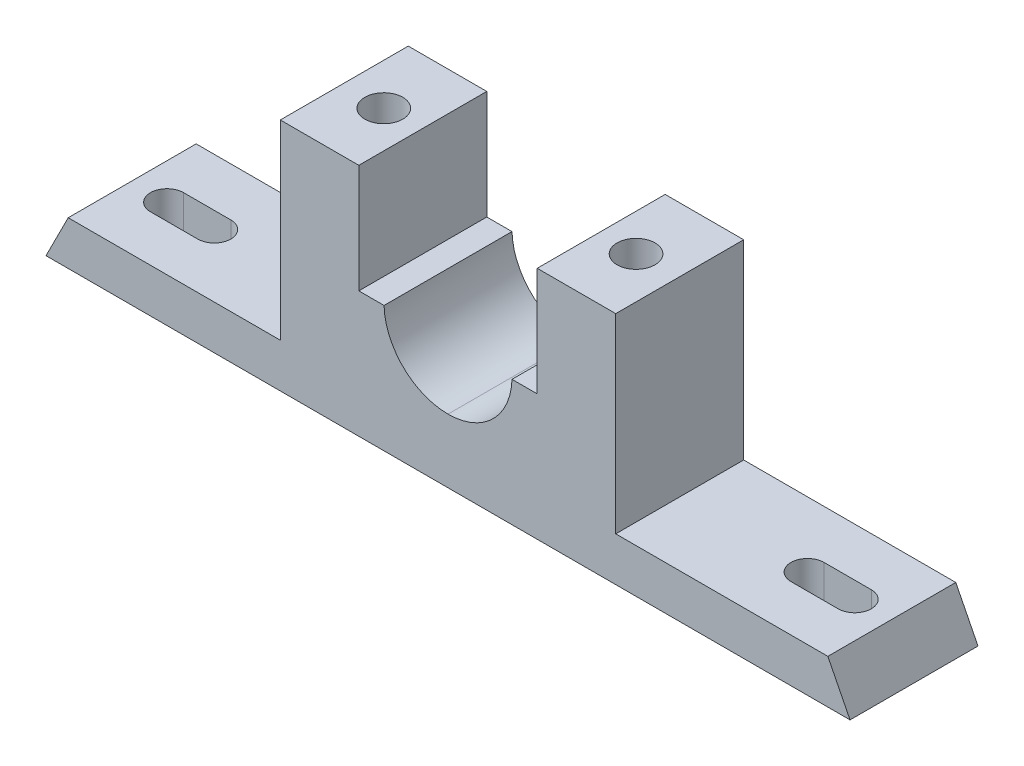
ISO-10303-21;
HEADER;
FILE_DESCRIPTION(('STEP AP214'),'2;1');
FILE_NAME('part.step','',(''),(''),'','','');
FILE_SCHEMA(('AUTOMOTIVE_DESIGN { 1 0 10303 214 1 1 1 1 }'));
ENDSEC;
DATA;
#1=APPLICATION_CONTEXT('core data for automotive mechanical design processes');
#2=APPLICATION_PROTOCOL_DEFINITION('international standard','automotive_design',2000,#1);
#3=PRODUCT_CONTEXT('',#1,'mechanical');
#4=PRODUCT('Part','Part','',(#3));
#5=PRODUCT_RELATED_PRODUCT_CATEGORY('part','',(#4));
#6=PRODUCT_DEFINITION_FORMATION('','',#4);
#7=PRODUCT_DEFINITION_CONTEXT('part definition',#1,'design');
#8=PRODUCT_DEFINITION('design','',#6,#7);
#9=PRODUCT_DEFINITION_SHAPE('','',#8);
#10=(LENGTH_UNIT() NAMED_UNIT(*) SI_UNIT(.MILLI.,.METRE.));
#11=(NAMED_UNIT(*) PLANE_ANGLE_UNIT() SI_UNIT($,.RADIAN.));
#12=(NAMED_UNIT(*) SI_UNIT($,.STERADIAN.) SOLID_ANGLE_UNIT());
#13=UNCERTAINTY_MEASURE_WITH_UNIT(LENGTH_MEASURE(1.E-05),#10,'distance_accuracy_value','');
#14=(GEOMETRIC_REPRESENTATION_CONTEXT(3) GLOBAL_UNCERTAINTY_ASSIGNED_CONTEXT((#13)) GLOBAL_UNIT_ASSIGNED_CONTEXT((#10,
#11,#12)) REPRESENTATION_CONTEXT('',''));
#15=CARTESIAN_POINT('',(0.,0.,0.));
#16=DIRECTION('',(0.,0.,1.));
#17=DIRECTION('',(1.,0.,0.));
#18=AXIS2_PLACEMENT_3D('',#15,#16,#17);
#19=CARTESIAN_POINT('',(201.084112149531,0.,64.));
#20=DIRECTION('',(0.,1.,0.));
#21=DIRECTION('',(0.,0.,1.));
#22=AXIS2_PLACEMENT_3D('',#19,#20,#21);
#23=PLANE('',#22);
#24=CARTESIAN_POINT('',(63.0841121495307,0.,33.0360593834774));
#25=DIRECTION('',(0.,-1.,0.));
#26=DIRECTION('',(0.,0.,-1.));
#27=AXIS2_PLACEMENT_3D('',#24,#25,#26);
#28=CIRCLE('',#27,15.);
#29=CARTESIAN_POINT('',(63.0841121495307,0.,18.0360593834774));
#30=VERTEX_POINT('',#29);
#31=EDGE_CURVE('E479',#30,#30,#28,.T.);
#32=ORIENTED_EDGE('',*,*,#31,.F.);
#33=EDGE_LOOP('',(#32));
#34=FACE_BOUND('',#33,.T.);
#35=DIRECTION('',(1.,0.,0.));
#36=VECTOR('',#35,1.);
#37=CARTESIAN_POINT('',(201.084112149531,0.,0.));
#38=LINE('',#37,#36);
#39=CARTESIAN_POINT('',(-201.084112149531,0.,0.));
#40=VERTEX_POINT('',#39);
#41=CARTESIAN_POINT('',(201.084112149531,0.,0.));
#42=VERTEX_POINT('',#41);
#43=EDGE_CURVE('E298',#40,#42,#38,.T.);
#44=ORIENTED_EDGE('',*,*,#43,.T.);
#45=DIRECTION('',(0.,0.,-1.));
#46=VECTOR('',#45,1.);
#47=CARTESIAN_POINT('',(201.084112149531,0.,64.));
#48=LINE('',#47,#46);
#49=CARTESIAN_POINT('',(201.084112149531,0.,64.));
#50=VERTEX_POINT('',#49);
#51=EDGE_CURVE('E11',#50,#42,#48,.T.);
#52=ORIENTED_EDGE('',*,*,#51,.F.);
#53=DIRECTION('',(1.,0.,0.));
#54=VECTOR('',#53,1.);
#55=CARTESIAN_POINT('',(201.084112149531,0.,64.));
#56=LINE('',#55,#54);
#57=CARTESIAN_POINT('',(-201.084112149531,0.,64.));
#58=VERTEX_POINT('',#57);
#59=EDGE_CURVE('E299',#58,#50,#56,.T.);
#60=ORIENTED_EDGE('',*,*,#59,.F.);
#61=DIRECTION('',(0.,0.,-1.));
#62=VECTOR('',#61,1.);
#63=CARTESIAN_POINT('',(-201.084112149531,0.,64.));
#64=LINE('',#63,#62);
#65=EDGE_CURVE('E346',#58,#40,#64,.T.);
#66=ORIENTED_EDGE('',*,*,#65,.T.);
#67=EDGE_LOOP('',(#44,#52,#60,#66));
#68=FACE_BOUND('',#67,.T.);
#69=DIRECTION('',(-1.,0.,0.));
#70=VECTOR('',#69,1.);
#71=CARTESIAN_POINT('',(201.084112149531,0.,24.2735142922361));
#72=LINE('',#71,#70);
#73=CARTESIAN_POINT('',(-148.363703714019,0.,24.2735142922361));
#74=VERTEX_POINT('',#73);
#75=CARTESIAN_POINT('',(-171.985857657313,0.,24.2735142922361));
#76=VERTEX_POINT('',#75);
#77=EDGE_CURVE('E290',#74,#76,#72,.T.);
#78=ORIENTED_EDGE('',*,*,#77,.T.);
#79=CARTESIAN_POINT('',(-171.985857657313,0.,32.5619893600584));
#80=DIRECTION('',(0.,1.,0.));
#81=DIRECTION('',(0.,0.,1.));
#82=AXIS2_PLACEMENT_3D('',#79,#80,#81);
#83=CIRCLE('',#82,8.28847506782232);
#84=CARTESIAN_POINT('',(-171.985857657313,0.,40.8504644278807));
#85=VERTEX_POINT('',#84);
#86=EDGE_CURVE('E294',#76,#85,#83,.T.);
#87=ORIENTED_EDGE('',*,*,#86,.T.);
#88=DIRECTION('',(1.,0.,0.));
#89=VECTOR('',#88,1.);
#90=CARTESIAN_POINT('',(201.084112149531,0.,40.8504644278807));
#91=LINE('',#90,#89);
#92=CARTESIAN_POINT('',(-148.363703714019,0.,40.8504644278807));
#93=VERTEX_POINT('',#92);
#94=EDGE_CURVE('E273',#85,#93,#91,.T.);
#95=ORIENTED_EDGE('',*,*,#94,.T.);
#96=CARTESIAN_POINT('',(-148.363703714019,0.,32.5619893600584));
#97=DIRECTION('',(0.,1.,0.));
#98=DIRECTION('',(0.,0.,1.));
#99=AXIS2_PLACEMENT_3D('',#96,#97,#98);
#100=CIRCLE('',#99,8.28847506782232);
#101=EDGE_CURVE('E286',#93,#74,#100,.T.);
#102=ORIENTED_EDGE('',*,*,#101,.T.);
#103=EDGE_LOOP('',(#78,#87,#95,#102));
#104=FACE_BOUND('',#103,.T.);
#105=CARTESIAN_POINT('',(-63.0841121495307,0.,33.0360593834774));
#106=DIRECTION('',(0.,-1.,0.));
#107=DIRECTION('',(0.,0.,-1.));
#108=AXIS2_PLACEMENT_3D('',#105,#106,#107);
#109=CIRCLE('',#108,15.);
#110=CARTESIAN_POINT('',(-63.0841121495307,0.,18.0360593834774));
#111=VERTEX_POINT('',#110);
#112=EDGE_CURVE('E241',#111,#111,#109,.T.);
#113=ORIENTED_EDGE('',*,*,#112,.F.);
#114=EDGE_LOOP('',(#113));
#115=FACE_BOUND('',#114,.T.);
#116=CARTESIAN_POINT('',(171.985857657313,0.,32.5619893600584));
#117=DIRECTION('',(0.,1.,0.));
#118=DIRECTION('',(0.,0.,1.));
#119=AXIS2_PLACEMENT_3D('',#116,#117,#118);
#120=CIRCLE('',#119,8.28847506782232);
#121=CARTESIAN_POINT('',(171.985857657313,0.,24.2735142922361));
#122=VERTEX_POINT('',#121);
#123=CARTESIAN_POINT('',(171.985857657313,0.,40.8504644278807));
#124=VERTEX_POINT('',#123);
#125=EDGE_CURVE('E238',#122,#124,#120,.F.);
#126=ORIENTED_EDGE('',*,*,#125,.F.);
#127=DIRECTION('',(1.,0.,0.));
#128=VECTOR('',#127,1.);
#129=CARTESIAN_POINT('',(201.084112149531,0.,24.2735142922361));
#130=LINE('',#129,#128);
#131=CARTESIAN_POINT('',(148.363703714019,0.,24.2735142922361));
#132=VERTEX_POINT('',#131);
#133=EDGE_CURVE('E226',#132,#122,#130,.T.);
#134=ORIENTED_EDGE('',*,*,#133,.F.);
#135=CARTESIAN_POINT('',(148.363703714019,0.,32.5619893600584));
#136=DIRECTION('',(0.,1.,0.));
#137=DIRECTION('',(0.,0.,1.));
#138=AXIS2_PLACEMENT_3D('',#135,#136,#137);
#139=CIRCLE('',#138,8.28847506782232);
#140=CARTESIAN_POINT('',(148.363703714019,0.,40.8504644278807));
#141=VERTEX_POINT('',#140);
#142=EDGE_CURVE('E202',#141,#132,#139,.F.);
#143=ORIENTED_EDGE('',*,*,#142,.F.);
#144=DIRECTION('',(-1.,0.,0.));
#145=VECTOR('',#144,1.);
#146=CARTESIAN_POINT('',(201.084112149531,0.,40.8504644278807));
#147=LINE('',#146,#145);
#148=EDGE_CURVE('E235',#124,#141,#147,.T.);
#149=ORIENTED_EDGE('',*,*,#148,.F.);
#150=EDGE_LOOP('',(#126,#134,#143,#149));
#151=FACE_BOUND('',#150,.T.);
#152=ADVANCED_FACE('F39',(#34,#68,#104,#115,#151),#23,.F.);
#153=CARTESIAN_POINT('',(189.981308411215,22.,64.));
#154=DIRECTION('',(0.,-1.,0.));
#155=DIRECTION('',(0.,0.,-1.));
#156=AXIS2_PLACEMENT_3D('',#153,#154,#155);
#157=PLANE('',#156);
#158=DIRECTION('',(-1.,0.,0.));
#159=VECTOR('',#158,1.);
#160=CARTESIAN_POINT('',(189.981308411215,22.,0.));
#161=LINE('',#160,#159);
#162=CARTESIAN_POINT('',(189.981308411215,22.,0.));
#163=VERTEX_POINT('',#162);
#164=CARTESIAN_POINT('',(83.8878504672898,22.,0.));
#165=VERTEX_POINT('',#164);
#166=EDGE_CURVE('E353',#163,#165,#161,.T.);
#167=ORIENTED_EDGE('',*,*,#166,.T.);
#168=DIRECTION('',(0.,0.,-1.));
#169=VECTOR('',#168,1.);
#170=CARTESIAN_POINT('',(83.8878504672898,22.,64.));
#171=LINE('',#170,#169);
#172=CARTESIAN_POINT('',(83.8878504672898,22.,64.));
#173=VERTEX_POINT('',#172);
#174=EDGE_CURVE('E438',#173,#165,#171,.T.);
#175=ORIENTED_EDGE('',*,*,#174,.F.);
#176=DIRECTION('',(-1.,0.,0.));
#177=VECTOR('',#176,1.);
#178=CARTESIAN_POINT('',(189.981308411215,22.,64.));
#179=LINE('',#178,#177);
#180=CARTESIAN_POINT('',(189.981308411215,22.,64.));
#181=VERTEX_POINT('',#180);
#182=EDGE_CURVE('E307',#181,#173,#179,.T.);
#183=ORIENTED_EDGE('',*,*,#182,.F.);
#184=DIRECTION('',(0.,0.,-1.));
#185=VECTOR('',#184,1.);
#186=CARTESIAN_POINT('',(189.981308411215,22.,64.));
#187=LINE('',#186,#185);
#188=EDGE_CURVE('E48',#181,#163,#187,.T.);
#189=ORIENTED_EDGE('',*,*,#188,.T.);
#190=EDGE_LOOP('',(#167,#175,#183,#189));
#191=FACE_BOUND('',#190,.T.);
#192=CARTESIAN_POINT('',(171.985857657313,22.,32.5619893600584));
#193=DIRECTION('',(0.,-1.,0.));
#194=DIRECTION('',(0.,0.,1.));
#195=AXIS2_PLACEMENT_3D('',#192,#193,#194);
#196=CIRCLE('',#195,8.28847506782232);
#197=CARTESIAN_POINT('',(171.985857657313,22.,24.2735142922361));
#198=VERTEX_POINT('',#197);
#199=CARTESIAN_POINT('',(171.985857657313,22.,40.8504644278807));
#200=VERTEX_POINT('',#199);
#201=EDGE_CURVE('E64',#198,#200,#196,.T.);
#202=ORIENTED_EDGE('',*,*,#201,.T.);
#203=DIRECTION('',(-1.,0.,0.));
#204=VECTOR('',#203,1.);
#205=CARTESIAN_POINT('',(171.985857657313,22.,40.8504644278807));
#206=LINE('',#205,#204);
#207=CARTESIAN_POINT('',(148.363703714019,22.,40.8504644278807));
#208=VERTEX_POINT('',#207);
#209=EDGE_CURVE('E216',#200,#208,#206,.T.);
#210=ORIENTED_EDGE('',*,*,#209,.T.);
#211=CARTESIAN_POINT('',(148.363703714019,22.,32.5619893600584));
#212=DIRECTION('',(0.,-1.,0.));
#213=DIRECTION('',(0.,0.,1.));
#214=AXIS2_PLACEMENT_3D('',#211,#212,#213);
#215=CIRCLE('',#214,8.28847506782232);
#216=CARTESIAN_POINT('',(148.363703714019,22.,24.2735142922361));
#217=VERTEX_POINT('',#216);
#218=EDGE_CURVE('E199',#208,#217,#215,.T.);
#219=ORIENTED_EDGE('',*,*,#218,.T.);
#220=DIRECTION('',(1.,0.,0.));
#221=VECTOR('',#220,1.);
#222=CARTESIAN_POINT('',(171.985857657313,22.,24.2735142922361));
#223=LINE('',#222,#221);
#224=EDGE_CURVE('E209',#217,#198,#223,.T.);
#225=ORIENTED_EDGE('',*,*,#224,.T.);
#226=EDGE_LOOP('',(#202,#210,#219,#225));
#227=FACE_BOUND('',#226,.T.);
#228=ADVANCED_FACE('F214',(#191,#227),#157,.F.);
#229=CARTESIAN_POINT('',(201.084112149531,0.,64.));
#230=DIRECTION('',(-0.892752268715273,-0.450547873930987,0.));
#231=DIRECTION('',(0.450547873930987,-0.892752268715273,0.));
#232=AXIS2_PLACEMENT_3D('',#229,#230,#231);
#233=PLANE('',#232);
#234=DIRECTION('',(-0.450547873930987,0.892752268715273,0.));
#235=VECTOR('',#234,1.);
#236=CARTESIAN_POINT('',(201.084112149531,0.,0.));
#237=LINE('',#236,#235);
#238=EDGE_CURVE('E350',#42,#163,#237,.T.);
#239=ORIENTED_EDGE('',*,*,#238,.T.);
#240=ORIENTED_EDGE('',*,*,#188,.F.);
#241=DIRECTION('',(-0.450547873930987,0.892752268715273,0.));
#242=VECTOR('',#241,1.);
#243=CARTESIAN_POINT('',(201.084112149531,0.,64.));
#244=LINE('',#243,#242);
#245=EDGE_CURVE('E303',#50,#181,#244,.T.);
#246=ORIENTED_EDGE('',*,*,#245,.F.);
#247=ORIENTED_EDGE('',*,*,#51,.T.);
#248=EDGE_LOOP('',(#239,#240,#246,#247));
#249=FACE_BOUND('',#248,.T.);
#250=ADVANCED_FACE('F473',(#249),#233,.F.);
#251=CARTESIAN_POINT('',(83.8878504672898,22.,64.));
#252=DIRECTION('',(-1.,0.,0.));
#253=DIRECTION('',(0.,0.,1.));
#254=AXIS2_PLACEMENT_3D('',#251,#252,#253);
#255=PLANE('',#254);
#256=DIRECTION('',(0.,1.,0.));
#257=VECTOR('',#256,1.);
#258=CARTESIAN_POINT('',(83.8878504672898,22.,0.));
#259=LINE('',#258,#257);
#260=CARTESIAN_POINT('',(83.8878504672898,117.401869158879,0.));
#261=VERTEX_POINT('',#260);
#262=EDGE_CURVE('E356',#165,#261,#259,.T.);
#263=ORIENTED_EDGE('',*,*,#262,.T.);
#264=DIRECTION('',(0.,0.,-1.));
#265=VECTOR('',#264,1.);
#266=CARTESIAN_POINT('',(83.8878504672898,117.401869158879,64.));
#267=LINE('',#266,#265);
#268=CARTESIAN_POINT('',(83.8878504672898,117.401869158879,64.));
#269=VERTEX_POINT('',#268);
#270=EDGE_CURVE('E434',#269,#261,#267,.T.);
#271=ORIENTED_EDGE('',*,*,#270,.F.);
#272=DIRECTION('',(0.,1.,0.));
#273=VECTOR('',#272,1.);
#274=CARTESIAN_POINT('',(83.8878504672898,22.,64.));
#275=LINE('',#274,#273);
#276=EDGE_CURVE('E310',#173,#269,#275,.T.);
#277=ORIENTED_EDGE('',*,*,#276,.F.);
#278=ORIENTED_EDGE('',*,*,#174,.T.);
#279=EDGE_LOOP('',(#263,#271,#277,#278));
#280=FACE_BOUND('',#279,.T.);
#281=ADVANCED_FACE('F744',(#280),#255,.F.);
#282=CARTESIAN_POINT('',(83.8878504672898,117.401869158879,64.));
#283=DIRECTION('',(0.,-1.,0.));
#284=DIRECTION('',(0.,0.,-1.));
#285=AXIS2_PLACEMENT_3D('',#282,#283,#284);
#286=PLANE('',#285);
#287=CARTESIAN_POINT('',(63.0841121495307,117.401869158879,33.0360593834774));
#288=DIRECTION('',(0.,-1.,0.));
#289=DIRECTION('',(0.,0.,-1.));
#290=AXIS2_PLACEMENT_3D('',#287,#288,#289);
#291=CIRCLE('',#290,9.49999999999997);
#292=CARTESIAN_POINT('',(63.0841121495307,117.401869158879,23.5360593834774));
#293=VERTEX_POINT('',#292);
#294=EDGE_CURVE('E42',#293,#293,#291,.T.);
#295=ORIENTED_EDGE('',*,*,#294,.T.);
#296=EDGE_LOOP('',(#295));
#297=FACE_BOUND('',#296,.T.);
#298=DIRECTION('',(-1.,0.,0.));
#299=VECTOR('',#298,1.);
#300=CARTESIAN_POINT('',(83.8878504672898,117.401869158879,0.));
#301=LINE('',#300,#299);
#302=CARTESIAN_POINT('',(44.6133321294614,117.401869158879,0.));
#303=VERTEX_POINT('',#302);
#304=EDGE_CURVE('E359',#261,#303,#301,.T.);
#305=ORIENTED_EDGE('',*,*,#304,.T.);
#306=DIRECTION('',(0.,0.,-1.));
#307=VECTOR('',#306,1.);
#308=CARTESIAN_POINT('',(44.6133321294614,117.401869158879,64.));
#309=LINE('',#308,#307);
#310=CARTESIAN_POINT('',(44.6133321294614,117.401869158879,64.));
#311=VERTEX_POINT('',#310);
#312=EDGE_CURVE('E430',#311,#303,#309,.T.);
#313=ORIENTED_EDGE('',*,*,#312,.F.);
#314=DIRECTION('',(-1.,0.,0.));
#315=VECTOR('',#314,1.);
#316=CARTESIAN_POINT('',(83.8878504672898,117.401869158879,64.));
#317=LINE('',#316,#315);
#318=EDGE_CURVE('E313',#269,#311,#317,.T.);
#319=ORIENTED_EDGE('',*,*,#318,.F.);
#320=ORIENTED_EDGE('',*,*,#270,.T.);
#321=EDGE_LOOP('',(#305,#313,#319,#320));
#322=FACE_BOUND('',#321,.T.);
#323=ADVANCED_FACE('F735',(#297,#322),#286,.F.);
#324=CARTESIAN_POINT('',(44.6133321294614,117.401869158879,64.));
#325=DIRECTION('',(1.,0.,0.));
#326=DIRECTION('',(0.,1.,0.));
#327=AXIS2_PLACEMENT_3D('',#324,#325,#326);
#328=PLANE('',#327);
#329=DIRECTION('',(0.,-1.,0.));
#330=VECTOR('',#329,1.);
#331=CARTESIAN_POINT('',(44.6133321294614,117.401869158879,0.));
#332=LINE('',#331,#330);
#333=CARTESIAN_POINT('',(44.6133321294614,63.,0.));
#334=VERTEX_POINT('',#333);
#335=EDGE_CURVE('E362',#303,#334,#332,.T.);
#336=ORIENTED_EDGE('',*,*,#335,.T.);
#337=DIRECTION('',(0.,0.,-1.));
#338=VECTOR('',#337,1.);
#339=CARTESIAN_POINT('',(44.6133321294614,63.,64.));
#340=LINE('',#339,#338);
#341=CARTESIAN_POINT('',(44.6133321294614,63.,64.));
#342=VERTEX_POINT('',#341);
#343=EDGE_CURVE('E426',#342,#334,#340,.T.);
#344=ORIENTED_EDGE('',*,*,#343,.F.);
#345=DIRECTION('',(0.,-1.,0.));
#346=VECTOR('',#345,1.);
#347=CARTESIAN_POINT('',(44.6133321294614,117.401869158879,64.));
#348=LINE('',#347,#346);
#349=EDGE_CURVE('E316',#311,#342,#348,.T.);
#350=ORIENTED_EDGE('',*,*,#349,.F.);
#351=ORIENTED_EDGE('',*,*,#312,.T.);
#352=EDGE_LOOP('',(#336,#344,#350,#351));
#353=FACE_BOUND('',#352,.T.);
#354=ADVANCED_FACE('F726',(#353),#328,.F.);
#355=CARTESIAN_POINT('',(44.6133321294614,63.,64.));
#356=DIRECTION('',(0.,-1.,0.));
#357=DIRECTION('',(1.,0.,0.));
#358=AXIS2_PLACEMENT_3D('',#355,#356,#357);
#359=PLANE('',#358);
#360=DIRECTION('',(-1.,0.,0.));
#361=VECTOR('',#360,1.);
#362=CARTESIAN_POINT('',(44.6133321294614,63.,0.));
#363=LINE('',#362,#361);
#364=CARTESIAN_POINT('',(32.,63.,0.));
#365=VERTEX_POINT('',#364);
#366=EDGE_CURVE('E365',#334,#365,#363,.T.);
#367=ORIENTED_EDGE('',*,*,#366,.T.);
#368=DIRECTION('',(0.,0.,-1.));
#369=VECTOR('',#368,1.);
#370=CARTESIAN_POINT('',(32.,63.,64.));
#371=LINE('',#370,#369);
#372=CARTESIAN_POINT('',(32.,63.,64.));
#373=VERTEX_POINT('',#372);
#374=EDGE_CURVE('E422',#373,#365,#371,.T.);
#375=ORIENTED_EDGE('',*,*,#374,.F.);
#376=DIRECTION('',(-1.,0.,0.));
#377=VECTOR('',#376,1.);
#378=CARTESIAN_POINT('',(44.6133321294614,63.,64.));
#379=LINE('',#378,#377);
#380=EDGE_CURVE('E319',#342,#373,#379,.T.);
#381=ORIENTED_EDGE('',*,*,#380,.F.);
#382=ORIENTED_EDGE('',*,*,#343,.T.);
#383=EDGE_LOOP('',(#367,#375,#381,#382));
#384=FACE_BOUND('',#383,.T.);
#385=ADVANCED_FACE('F717',(#384),#359,.F.);
#386=CARTESIAN_POINT('',(0.0131821762817744,63.9184146733701,64.));
#387=DIRECTION('',(0.,0.,-1.));
#388=DIRECTION('',(-1.,0.,0.));
#389=AXIS2_PLACEMENT_3D('',#386,#387,#388);
#390=CYLINDRICAL_SURFACE('',#389,32.);
#391=CARTESIAN_POINT('',(0.0131821762817744,63.9184146733701,0.));
#392=DIRECTION('',(0.,0.,-1.));
#393=DIRECTION('',(-1.,0.,0.));
#394=AXIS2_PLACEMENT_3D('',#391,#392,#393);
#395=CIRCLE('',#394,32.);
#396=CARTESIAN_POINT('',(0.,31.9184173885229,0.));
#397=VERTEX_POINT('',#396);
#398=EDGE_CURVE('E368',#365,#397,#395,.T.);
#399=ORIENTED_EDGE('',*,*,#398,.T.);
#400=DIRECTION('',(0.,0.,-1.));
#401=VECTOR('',#400,1.);
#402=CARTESIAN_POINT('',(0.,31.9184173885229,64.));
#403=LINE('',#402,#401);
#404=CARTESIAN_POINT('',(0.,31.9184173885229,64.));
#405=VERTEX_POINT('',#404);
#406=EDGE_CURVE('E418',#405,#397,#403,.T.);
#407=ORIENTED_EDGE('',*,*,#406,.F.);
#408=CARTESIAN_POINT('',(0.0131821762817744,63.9184146733701,64.));
#409=DIRECTION('',(0.,0.,-1.));
#410=DIRECTION('',(-1.,0.,0.));
#411=AXIS2_PLACEMENT_3D('',#408,#409,#410);
#412=CIRCLE('',#411,32.);
#413=EDGE_CURVE('E322',#373,#405,#412,.T.);
#414=ORIENTED_EDGE('',*,*,#413,.F.);
#415=ORIENTED_EDGE('',*,*,#374,.T.);
#416=EDGE_LOOP('',(#399,#407,#414,#415));
#417=FACE_BOUND('',#416,.T.);
#418=ADVANCED_FACE('F708',(#417),#390,.F.);
#419=CARTESIAN_POINT('',(-0.0131821762817744,63.9184146733701,64.));
#420=DIRECTION('',(0.,0.,-1.));
#421=DIRECTION('',(-1.,0.,0.));
#422=AXIS2_PLACEMENT_3D('',#419,#420,#421);
#423=CYLINDRICAL_SURFACE('',#422,32.);
#424=CARTESIAN_POINT('',(-0.0131821762817744,63.9184146733701,0.));
#425=DIRECTION('',(0.,0.,-1.));
#426=DIRECTION('',(1.,0.,0.));
#427=AXIS2_PLACEMENT_3D('',#424,#425,#426);
#428=CIRCLE('',#427,32.);
#429=CARTESIAN_POINT('',(-32.,63.,0.));
#430=VERTEX_POINT('',#429);
#431=EDGE_CURVE('E371',#397,#430,#428,.T.);
#432=ORIENTED_EDGE('',*,*,#431,.T.);
#433=DIRECTION('',(0.,0.,-1.));
#434=VECTOR('',#433,1.);
#435=CARTESIAN_POINT('',(-32.,63.,64.));
#436=LINE('',#435,#434);
#437=CARTESIAN_POINT('',(-32.,63.,64.));
#438=VERTEX_POINT('',#437);
#439=EDGE_CURVE('E414',#438,#430,#436,.T.);
#440=ORIENTED_EDGE('',*,*,#439,.F.);
#441=CARTESIAN_POINT('',(-0.0131821762817744,63.9184146733701,64.));
#442=DIRECTION('',(0.,0.,-1.));
#443=DIRECTION('',(1.,0.,0.));
#444=AXIS2_PLACEMENT_3D('',#441,#442,#443);
#445=CIRCLE('',#444,32.);
#446=EDGE_CURVE('E325',#405,#438,#445,.T.);
#447=ORIENTED_EDGE('',*,*,#446,.F.);
#448=ORIENTED_EDGE('',*,*,#406,.T.);
#449=EDGE_LOOP('',(#432,#440,#447,#448));
#450=FACE_BOUND('',#449,.T.);
#451=ADVANCED_FACE('F699',(#450),#423,.F.);
#452=CARTESIAN_POINT('',(-44.6133321294614,63.,64.));
#453=DIRECTION('',(0.,-1.,0.));
#454=DIRECTION('',(1.,0.,0.));
#455=AXIS2_PLACEMENT_3D('',#452,#453,#454);
#456=PLANE('',#455);
#457=DIRECTION('',(-1.,0.,0.));
#458=VECTOR('',#457,1.);
#459=CARTESIAN_POINT('',(-44.6133321294614,63.,0.));
#460=LINE('',#459,#458);
#461=CARTESIAN_POINT('',(-44.6133321294614,63.,0.));
#462=VERTEX_POINT('',#461);
#463=EDGE_CURVE('E374',#430,#462,#460,.T.);
#464=ORIENTED_EDGE('',*,*,#463,.T.);
#465=DIRECTION('',(0.,0.,-1.));
#466=VECTOR('',#465,1.);
#467=CARTESIAN_POINT('',(-44.6133321294614,63.,64.));
#468=LINE('',#467,#466);
#469=CARTESIAN_POINT('',(-44.6133321294614,63.,64.));
#470=VERTEX_POINT('',#469);
#471=EDGE_CURVE('E410',#470,#462,#468,.T.);
#472=ORIENTED_EDGE('',*,*,#471,.F.);
#473=DIRECTION('',(-1.,0.,0.));
#474=VECTOR('',#473,1.);
#475=CARTESIAN_POINT('',(-44.6133321294614,63.,64.));
#476=LINE('',#475,#474);
#477=EDGE_CURVE('E328',#438,#470,#476,.T.);
#478=ORIENTED_EDGE('',*,*,#477,.F.);
#479=ORIENTED_EDGE('',*,*,#439,.T.);
#480=EDGE_LOOP('',(#464,#472,#478,#479));
#481=FACE_BOUND('',#480,.T.);
#482=ADVANCED_FACE('F690',(#481),#456,.F.);
#483=CARTESIAN_POINT('',(-44.6133321294614,117.401869158879,64.));
#484=DIRECTION('',(-1.,0.,0.));
#485=DIRECTION('',(0.,-1.,0.));
#486=AXIS2_PLACEMENT_3D('',#483,#484,#485);
#487=PLANE('',#486);
#488=DIRECTION('',(0.,1.,0.));
#489=VECTOR('',#488,1.);
#490=CARTESIAN_POINT('',(-44.6133321294614,117.401869158879,0.));
#491=LINE('',#490,#489);
#492=CARTESIAN_POINT('',(-44.6133321294614,117.401869158879,0.));
#493=VERTEX_POINT('',#492);
#494=EDGE_CURVE('E377',#462,#493,#491,.T.);
#495=ORIENTED_EDGE('',*,*,#494,.T.);
#496=DIRECTION('',(0.,0.,-1.));
#497=VECTOR('',#496,1.);
#498=CARTESIAN_POINT('',(-44.6133321294614,117.401869158879,64.));
#499=LINE('',#498,#497);
#500=CARTESIAN_POINT('',(-44.6133321294614,117.401869158879,64.));
#501=VERTEX_POINT('',#500);
#502=EDGE_CURVE('E406',#501,#493,#499,.T.);
#503=ORIENTED_EDGE('',*,*,#502,.F.);
#504=DIRECTION('',(0.,1.,0.));
#505=VECTOR('',#504,1.);
#506=CARTESIAN_POINT('',(-44.6133321294614,117.401869158879,64.));
#507=LINE('',#506,#505);
#508=EDGE_CURVE('E331',#470,#501,#507,.T.);
#509=ORIENTED_EDGE('',*,*,#508,.F.);
#510=ORIENTED_EDGE('',*,*,#471,.T.);
#511=EDGE_LOOP('',(#495,#503,#509,#510));
#512=FACE_BOUND('',#511,.T.);
#513=ADVANCED_FACE('F683',(#512),#487,.F.);
#514=CARTESIAN_POINT('',(-83.8878504672898,117.401869158879,64.));
#515=DIRECTION('',(0.,-1.,0.));
#516=DIRECTION('',(0.,0.,-1.));
#517=AXIS2_PLACEMENT_3D('',#514,#515,#516);
#518=PLANE('',#517);
#519=CARTESIAN_POINT('',(-63.0841121495307,117.401869158879,33.0360593834774));
#520=DIRECTION('',(0.,-1.,0.));
#521=DIRECTION('',(0.,0.,-1.));
#522=AXIS2_PLACEMENT_3D('',#519,#520,#521);
#523=CIRCLE('',#522,9.49999999999997);
#524=CARTESIAN_POINT('',(-63.0841121495307,117.401869158879,23.5360593834774));
#525=VERTEX_POINT('',#524);
#526=EDGE_CURVE('E253',#525,#525,#523,.T.);
#527=ORIENTED_EDGE('',*,*,#526,.T.);
#528=EDGE_LOOP('',(#527));
#529=FACE_BOUND('',#528,.T.);
#530=DIRECTION('',(-1.,0.,0.));
#531=VECTOR('',#530,1.);
#532=CARTESIAN_POINT('',(-83.8878504672898,117.401869158879,0.));
#533=LINE('',#532,#531);
#534=CARTESIAN_POINT('',(-83.8878504672898,117.401869158879,0.));
#535=VERTEX_POINT('',#534);
#536=EDGE_CURVE('E380',#493,#535,#533,.T.);
#537=ORIENTED_EDGE('',*,*,#536,.T.);
#538=DIRECTION('',(0.,0.,-1.));
#539=VECTOR('',#538,1.);
#540=CARTESIAN_POINT('',(-83.8878504672898,117.401869158879,64.));
#541=LINE('',#540,#539);
#542=CARTESIAN_POINT('',(-83.8878504672898,117.401869158879,64.));
#543=VERTEX_POINT('',#542);
#544=EDGE_CURVE('E402',#543,#535,#541,.T.);
#545=ORIENTED_EDGE('',*,*,#544,.F.);
#546=DIRECTION('',(-1.,0.,0.));
#547=VECTOR('',#546,1.);
#548=CARTESIAN_POINT('',(-83.8878504672898,117.401869158879,64.));
#549=LINE('',#548,#547);
#550=EDGE_CURVE('E334',#501,#543,#549,.T.);
#551=ORIENTED_EDGE('',*,*,#550,.F.);
#552=ORIENTED_EDGE('',*,*,#502,.T.);
#553=EDGE_LOOP('',(#537,#545,#551,#552));
#554=FACE_BOUND('',#553,.T.);
#555=ADVANCED_FACE('F448',(#529,#554),#518,.F.);
#556=CARTESIAN_POINT('',(-83.8878504672898,22.,64.));
#557=DIRECTION('',(1.,0.,0.));
#558=DIRECTION('',(0.,0.,-1.));
#559=AXIS2_PLACEMENT_3D('',#556,#557,#558);
#560=PLANE('',#559);
#561=DIRECTION('',(0.,-1.,0.));
#562=VECTOR('',#561,1.);
#563=CARTESIAN_POINT('',(-83.8878504672898,22.,0.));
#564=LINE('',#563,#562);
#565=CARTESIAN_POINT('',(-83.8878504672898,22.,0.));
#566=VERTEX_POINT('',#565);
#567=EDGE_CURVE('E383',#535,#566,#564,.T.);
#568=ORIENTED_EDGE('',*,*,#567,.T.);
#569=DIRECTION('',(0.,0.,-1.));
#570=VECTOR('',#569,1.);
#571=CARTESIAN_POINT('',(-83.8878504672898,22.,64.));
#572=LINE('',#571,#570);
#573=CARTESIAN_POINT('',(-83.8878504672898,22.,64.));
#574=VERTEX_POINT('',#573);
#575=EDGE_CURVE('E398',#574,#566,#572,.T.);
#576=ORIENTED_EDGE('',*,*,#575,.F.);
#577=DIRECTION('',(0.,-1.,0.));
#578=VECTOR('',#577,1.);
#579=CARTESIAN_POINT('',(-83.8878504672898,22.,64.));
#580=LINE('',#579,#578);
#581=EDGE_CURVE('E337',#543,#574,#580,.T.);
#582=ORIENTED_EDGE('',*,*,#581,.F.);
#583=ORIENTED_EDGE('',*,*,#544,.T.);
#584=EDGE_LOOP('',(#568,#576,#582,#583));
#585=FACE_BOUND('',#584,.T.);
#586=ADVANCED_FACE('F667',(#585),#560,.F.);
#587=CARTESIAN_POINT('',(-189.981308411215,22.,64.));
#588=DIRECTION('',(0.,-1.,0.));
#589=DIRECTION('',(0.,0.,-1.));
#590=AXIS2_PLACEMENT_3D('',#587,#588,#589);
#591=PLANE('',#590);
#592=DIRECTION('',(1.,0.,0.));
#593=VECTOR('',#592,1.);
#594=CARTESIAN_POINT('',(-171.985857657313,22.,40.8504644278807));
#595=LINE('',#594,#593);
#596=CARTESIAN_POINT('',(-171.985857657313,22.,40.8504644278807));
#597=VERTEX_POINT('',#596);
#598=CARTESIAN_POINT('',(-148.363703714019,22.,40.8504644278807));
#599=VERTEX_POINT('',#598);
#600=EDGE_CURVE('E257',#597,#599,#595,.T.);
#601=ORIENTED_EDGE('',*,*,#600,.F.);
#602=CARTESIAN_POINT('',(-171.985857657313,22.,32.5619893600584));
#603=DIRECTION('',(0.,1.,0.));
#604=DIRECTION('',(0.,0.,1.));
#605=AXIS2_PLACEMENT_3D('',#602,#603,#604);
#606=CIRCLE('',#605,8.28847506782232);
#607=CARTESIAN_POINT('',(-171.985857657313,22.,24.2735142922361));
#608=VERTEX_POINT('',#607);
#609=EDGE_CURVE('E254',#608,#597,#606,.T.);
#610=ORIENTED_EDGE('',*,*,#609,.F.);
#611=DIRECTION('',(-1.,0.,0.));
#612=VECTOR('',#611,1.);
#613=CARTESIAN_POINT('',(-171.985857657313,22.,24.2735142922361));
#614=LINE('',#613,#612);
#615=CARTESIAN_POINT('',(-148.363703714019,22.,24.2735142922361));
#616=VERTEX_POINT('',#615);
#617=EDGE_CURVE('E265',#616,#608,#614,.T.);
#618=ORIENTED_EDGE('',*,*,#617,.F.);
#619=CARTESIAN_POINT('',(-148.363703714019,22.,32.5619893600584));
#620=DIRECTION('',(0.,1.,0.));
#621=DIRECTION('',(0.,0.,1.));
#622=AXIS2_PLACEMENT_3D('',#619,#620,#621);
#623=CIRCLE('',#622,8.28847506782232);
#624=EDGE_CURVE('E261',#599,#616,#623,.T.);
#625=ORIENTED_EDGE('',*,*,#624,.F.);
#626=EDGE_LOOP('',(#601,#610,#618,#625));
#627=FACE_BOUND('',#626,.T.);
#628=DIRECTION('',(-1.,0.,0.));
#629=VECTOR('',#628,1.);
#630=CARTESIAN_POINT('',(-189.981308411215,22.,0.));
#631=LINE('',#630,#629);
#632=CARTESIAN_POINT('',(-189.981308411215,22.,0.));
#633=VERTEX_POINT('',#632);
#634=EDGE_CURVE('E386',#566,#633,#631,.T.);
#635=ORIENTED_EDGE('',*,*,#634,.T.);
#636=DIRECTION('',(0.,0.,-1.));
#637=VECTOR('',#636,1.);
#638=CARTESIAN_POINT('',(-189.981308411215,22.,64.));
#639=LINE('',#638,#637);
#640=CARTESIAN_POINT('',(-189.981308411215,22.,64.));
#641=VERTEX_POINT('',#640);
#642=EDGE_CURVE('E394',#641,#633,#639,.T.);
#643=ORIENTED_EDGE('',*,*,#642,.F.);
#644=DIRECTION('',(-1.,0.,0.));
#645=VECTOR('',#644,1.);
#646=CARTESIAN_POINT('',(-189.981308411215,22.,64.));
#647=LINE('',#646,#645);
#648=EDGE_CURVE('E340',#574,#641,#647,.T.);
#649=ORIENTED_EDGE('',*,*,#648,.F.);
#650=ORIENTED_EDGE('',*,*,#575,.T.);
#651=EDGE_LOOP('',(#635,#643,#649,#650));
#652=FACE_BOUND('',#651,.T.);
#653=ADVANCED_FACE('F658',(#627,#652),#591,.F.);
#654=CARTESIAN_POINT('',(-201.084112149531,0.,64.));
#655=DIRECTION('',(0.892752268715273,-0.450547873930987,0.));
#656=DIRECTION('',(0.450547873930987,0.892752268715273,0.));
#657=AXIS2_PLACEMENT_3D('',#654,#655,#656);
#658=PLANE('',#657);
#659=DIRECTION('',(-0.450547873930987,-0.892752268715273,0.));
#660=VECTOR('',#659,1.);
#661=CARTESIAN_POINT('',(-201.084112149531,0.,0.));
#662=LINE('',#661,#660);
#663=EDGE_CURVE('E304',#633,#40,#662,.T.);
#664=ORIENTED_EDGE('',*,*,#663,.T.);
#665=ORIENTED_EDGE('',*,*,#65,.F.);
#666=DIRECTION('',(-0.450547873930987,-0.892752268715273,0.));
#667=VECTOR('',#666,1.);
#668=CARTESIAN_POINT('',(-201.084112149531,0.,64.));
#669=LINE('',#668,#667);
#670=EDGE_CURVE('E343',#641,#58,#669,.T.);
#671=ORIENTED_EDGE('',*,*,#670,.F.);
#672=ORIENTED_EDGE('',*,*,#642,.T.);
#673=EDGE_LOOP('',(#664,#665,#671,#672));
#674=FACE_BOUND('',#673,.T.);
#675=ADVANCED_FACE('F649',(#674),#658,.F.);
#676=CARTESIAN_POINT('',(-0.0131821762817744,63.9184146733701,64.));
#677=DIRECTION('',(0.,0.,1.));
#678=DIRECTION('',(1.,0.,0.));
#679=AXIS2_PLACEMENT_3D('',#676,#677,#678);
#680=PLANE('',#679);
#681=ORIENTED_EDGE('',*,*,#59,.T.);
#682=ORIENTED_EDGE('',*,*,#245,.T.);
#683=ORIENTED_EDGE('',*,*,#182,.T.);
#684=ORIENTED_EDGE('',*,*,#276,.T.);
#685=ORIENTED_EDGE('',*,*,#318,.T.);
#686=ORIENTED_EDGE('',*,*,#349,.T.);
#687=ORIENTED_EDGE('',*,*,#380,.T.);
#688=ORIENTED_EDGE('',*,*,#413,.T.);
#689=ORIENTED_EDGE('',*,*,#446,.T.);
#690=ORIENTED_EDGE('',*,*,#477,.T.);
#691=ORIENTED_EDGE('',*,*,#508,.T.);
#692=ORIENTED_EDGE('',*,*,#550,.T.);
#693=ORIENTED_EDGE('',*,*,#581,.T.);
#694=ORIENTED_EDGE('',*,*,#648,.T.);
#695=ORIENTED_EDGE('',*,*,#670,.T.);
#696=EDGE_LOOP('',(#681,#682,#683,#684,#685,#686,#687,#688,#689,#690,#691,#692,#693,#694,#695));
#697=FACE_BOUND('',#696,.T.);
#698=ADVANCED_FACE('F640',(#697),#680,.T.);
#699=CARTESIAN_POINT('',(-0.0131821762817744,63.9184146733701,0.));
#700=DIRECTION('',(0.,0.,1.));
#701=DIRECTION('',(1.,0.,0.));
#702=AXIS2_PLACEMENT_3D('',#699,#700,#701);
#703=PLANE('',#702);
#704=ORIENTED_EDGE('',*,*,#43,.F.);
#705=ORIENTED_EDGE('',*,*,#663,.F.);
#706=ORIENTED_EDGE('',*,*,#634,.F.);
#707=ORIENTED_EDGE('',*,*,#567,.F.);
#708=ORIENTED_EDGE('',*,*,#536,.F.);
#709=ORIENTED_EDGE('',*,*,#494,.F.);
#710=ORIENTED_EDGE('',*,*,#463,.F.);
#711=ORIENTED_EDGE('',*,*,#431,.F.);
#712=ORIENTED_EDGE('',*,*,#398,.F.);
#713=ORIENTED_EDGE('',*,*,#366,.F.);
#714=ORIENTED_EDGE('',*,*,#335,.F.);
#715=ORIENTED_EDGE('',*,*,#304,.F.);
#716=ORIENTED_EDGE('',*,*,#262,.F.);
#717=ORIENTED_EDGE('',*,*,#166,.F.);
#718=ORIENTED_EDGE('',*,*,#238,.F.);
#719=EDGE_LOOP('',(#704,#705,#706,#707,#708,#709,#710,#711,#712,#713,#714,#715,#716,#717,#718));
#720=FACE_BOUND('',#719,.T.);
#721=ADVANCED_FACE('F630',(#720),#703,.F.);
#722=CARTESIAN_POINT('',(-171.985857657313,-42.,32.5619893600584));
#723=DIRECTION('',(0.,1.,0.));
#724=DIRECTION('',(0.,0.,1.));
#725=AXIS2_PLACEMENT_3D('',#722,#723,#724);
#726=CYLINDRICAL_SURFACE('',#725,8.28847506782232);
#727=DIRECTION('',(0.,1.,0.));
#728=VECTOR('',#727,1.);
#729=CARTESIAN_POINT('',(-171.985857657313,-42.,24.2735142922361));
#730=LINE('',#729,#728);
#731=EDGE_CURVE('E270',#76,#608,#730,.T.);
#732=ORIENTED_EDGE('',*,*,#731,.T.);
#733=ORIENTED_EDGE('',*,*,#609,.T.);
#734=DIRECTION('',(0.,1.,0.));
#735=VECTOR('',#734,1.);
#736=CARTESIAN_POINT('',(-171.985857657313,-42.,40.8504644278807));
#737=LINE('',#736,#735);
#738=EDGE_CURVE('E269',#85,#597,#737,.T.);
#739=ORIENTED_EDGE('',*,*,#738,.F.);
#740=ORIENTED_EDGE('',*,*,#86,.F.);
#741=EDGE_LOOP('',(#732,#733,#739,#740));
#742=FACE_BOUND('',#741,.T.);
#743=ADVANCED_FACE('F622',(#742),#726,.F.);
#744=CARTESIAN_POINT('',(-171.985857657313,-42.,24.2735142922361));
#745=DIRECTION('',(0.,0.,-1.));
#746=DIRECTION('',(-1.,0.,0.));
#747=AXIS2_PLACEMENT_3D('',#744,#745,#746);
#748=PLANE('',#747);
#749=DIRECTION('',(0.,1.,0.));
#750=VECTOR('',#749,1.);
#751=CARTESIAN_POINT('',(-148.363703714019,-42.,24.2735142922361));
#752=LINE('',#751,#750);
#753=EDGE_CURVE('E274',#74,#616,#752,.T.);
#754=ORIENTED_EDGE('',*,*,#753,.T.);
#755=ORIENTED_EDGE('',*,*,#617,.T.);
#756=ORIENTED_EDGE('',*,*,#731,.F.);
#757=ORIENTED_EDGE('',*,*,#77,.F.);
#758=EDGE_LOOP('',(#754,#755,#756,#757));
#759=FACE_BOUND('',#758,.T.);
#760=ADVANCED_FACE('F613',(#759),#748,.F.);
#761=CARTESIAN_POINT('',(-148.363703714019,-42.,32.5619893600584));
#762=DIRECTION('',(0.,1.,0.));
#763=DIRECTION('',(0.,0.,1.));
#764=AXIS2_PLACEMENT_3D('',#761,#762,#763);
#765=CYLINDRICAL_SURFACE('',#764,8.28847506782232);
#766=DIRECTION('',(0.,1.,0.));
#767=VECTOR('',#766,1.);
#768=CARTESIAN_POINT('',(-148.363703714019,-42.,40.8504644278807));
#769=LINE('',#768,#767);
#770=EDGE_CURVE('E277',#93,#599,#769,.T.);
#771=ORIENTED_EDGE('',*,*,#770,.T.);
#772=ORIENTED_EDGE('',*,*,#624,.T.);
#773=ORIENTED_EDGE('',*,*,#753,.F.);
#774=ORIENTED_EDGE('',*,*,#101,.F.);
#775=EDGE_LOOP('',(#771,#772,#773,#774));
#776=FACE_BOUND('',#775,.T.);
#777=ADVANCED_FACE('F464',(#776),#765,.F.);
#778=CARTESIAN_POINT('',(-171.985857657313,-42.,40.8504644278807));
#779=DIRECTION('',(0.,0.,1.));
#780=DIRECTION('',(1.,0.,0.));
#781=AXIS2_PLACEMENT_3D('',#778,#779,#780);
#782=PLANE('',#781);
#783=ORIENTED_EDGE('',*,*,#738,.T.);
#784=ORIENTED_EDGE('',*,*,#600,.T.);
#785=ORIENTED_EDGE('',*,*,#770,.F.);
#786=ORIENTED_EDGE('',*,*,#94,.F.);
#787=EDGE_LOOP('',(#783,#784,#785,#786));
#788=FACE_BOUND('',#787,.T.);
#789=ADVANCED_FACE('F454',(#788),#782,.F.);
#790=CARTESIAN_POINT('',(-63.0841121495307,0.,33.0360593834774));
#791=DIRECTION('',(0.,-1.,0.));
#792=DIRECTION('',(0.,0.,-1.));
#793=AXIS2_PLACEMENT_3D('',#790,#791,#792);
#794=CYLINDRICAL_SURFACE('',#793,9.49999999999997);
#795=CARTESIAN_POINT('',(-63.0841121495307,12.,33.0360593834774));
#796=DIRECTION('',(0.,-1.,0.));
#797=DIRECTION('',(0.,0.,-1.));
#798=AXIS2_PLACEMENT_3D('',#795,#796,#797);
#799=CIRCLE('',#798,9.49999999999998);
#800=CARTESIAN_POINT('',(-63.0841121495307,12.,23.5360593834774));
#801=VERTEX_POINT('',#800);
#802=EDGE_CURVE('E249',#801,#801,#799,.T.);
#803=ORIENTED_EDGE('',*,*,#802,.T.);
#804=EDGE_LOOP('',(#803));
#805=FACE_BOUND('',#804,.T.);
#806=ORIENTED_EDGE('',*,*,#526,.F.);
#807=EDGE_LOOP('',(#806));
#808=FACE_BOUND('',#807,.T.);
#809=ADVANCED_FACE('F451',(#805,#808),#794,.F.);
#810=CARTESIAN_POINT('',(-53.5841121495308,12.,33.0360593834774));
#811=DIRECTION('',(0.,1.,0.));
#812=DIRECTION('',(0.,0.,1.));
#813=AXIS2_PLACEMENT_3D('',#810,#811,#812);
#814=PLANE('',#813);
#815=ORIENTED_EDGE('',*,*,#802,.F.);
#816=EDGE_LOOP('',(#815));
#817=FACE_BOUND('',#816,.T.);
#818=CARTESIAN_POINT('',(-63.0841121495307,12.,33.0360593834774));
#819=DIRECTION('',(0.,-1.,0.));
#820=DIRECTION('',(0.,0.,-1.));
#821=AXIS2_PLACEMENT_3D('',#818,#819,#820);
#822=CIRCLE('',#821,15.);
#823=CARTESIAN_POINT('',(-63.0841121495307,12.,18.0360593834774));
#824=VERTEX_POINT('',#823);
#825=EDGE_CURVE('E245',#824,#824,#822,.T.);
#826=ORIENTED_EDGE('',*,*,#825,.T.);
#827=EDGE_LOOP('',(#826));
#828=FACE_BOUND('',#827,.T.);
#829=ADVANCED_FACE('F453',(#817,#828),#814,.F.);
#830=CARTESIAN_POINT('',(-63.0841121495307,0.,33.0360593834774));
#831=DIRECTION('',(0.,-1.,0.));
#832=DIRECTION('',(0.,0.,-1.));
#833=AXIS2_PLACEMENT_3D('',#830,#831,#832);
#834=CYLINDRICAL_SURFACE('',#833,15.);
#835=ORIENTED_EDGE('',*,*,#825,.F.);
#836=EDGE_LOOP('',(#835));
#837=FACE_BOUND('',#836,.T.);
#838=ORIENTED_EDGE('',*,*,#112,.T.);
#839=EDGE_LOOP('',(#838));
#840=FACE_BOUND('',#839,.T.);
#841=ADVANCED_FACE('F461',(#837,#840),#834,.F.);
#842=CARTESIAN_POINT('',(171.985857657313,-42.,32.5619893600584));
#843=DIRECTION('',(0.,1.,0.));
#844=DIRECTION('',(0.,0.,1.));
#845=AXIS2_PLACEMENT_3D('',#842,#843,#844);
#846=CYLINDRICAL_SURFACE('',#845,8.28847506782232);
#847=ORIENTED_EDGE('',*,*,#125,.T.);
#848=DIRECTION('',(0.,1.,0.));
#849=VECTOR('',#848,1.);
#850=CARTESIAN_POINT('',(171.985857657313,-42.,40.8504644278807));
#851=LINE('',#850,#849);
#852=EDGE_CURVE('E223',#124,#200,#851,.T.);
#853=ORIENTED_EDGE('',*,*,#852,.T.);
#854=ORIENTED_EDGE('',*,*,#201,.F.);
#855=DIRECTION('',(0.,1.,0.));
#856=VECTOR('',#855,1.);
#857=CARTESIAN_POINT('',(171.985857657313,-42.,24.2735142922361));
#858=LINE('',#857,#856);
#859=EDGE_CURVE('E206',#122,#198,#858,.T.);
#860=ORIENTED_EDGE('',*,*,#859,.F.);
#861=EDGE_LOOP('',(#847,#853,#854,#860));
#862=FACE_BOUND('',#861,.T.);
#863=ADVANCED_FACE('F489',(#862),#846,.F.);
#864=CARTESIAN_POINT('',(171.985857657313,-42.,40.8504644278807));
#865=DIRECTION('',(0.,0.,-1.));
#866=DIRECTION('',(-1.,0.,0.));
#867=AXIS2_PLACEMENT_3D('',#864,#865,#866);
#868=PLANE('',#867);
#869=ORIENTED_EDGE('',*,*,#148,.T.);
#870=DIRECTION('',(0.,1.,0.));
#871=VECTOR('',#870,1.);
#872=CARTESIAN_POINT('',(148.363703714019,-42.,40.8504644278807));
#873=LINE('',#872,#871);
#874=EDGE_CURVE('E205',#141,#208,#873,.T.);
#875=ORIENTED_EDGE('',*,*,#874,.T.);
#876=ORIENTED_EDGE('',*,*,#209,.F.);
#877=ORIENTED_EDGE('',*,*,#852,.F.);
#878=EDGE_LOOP('',(#869,#875,#876,#877));
#879=FACE_BOUND('',#878,.T.);
#880=ADVANCED_FACE('F491',(#879),#868,.T.);
#881=CARTESIAN_POINT('',(148.363703714019,-42.,32.5619893600584));
#882=DIRECTION('',(0.,1.,0.));
#883=DIRECTION('',(0.,0.,1.));
#884=AXIS2_PLACEMENT_3D('',#881,#882,#883);
#885=CYLINDRICAL_SURFACE('',#884,8.28847506782232);
#886=ORIENTED_EDGE('',*,*,#142,.T.);
#887=DIRECTION('',(0.,1.,0.));
#888=VECTOR('',#887,1.);
#889=CARTESIAN_POINT('',(148.363703714019,-42.,24.2735142922361));
#890=LINE('',#889,#888);
#891=EDGE_CURVE('E56',#132,#217,#890,.T.);
#892=ORIENTED_EDGE('',*,*,#891,.T.);
#893=ORIENTED_EDGE('',*,*,#218,.F.);
#894=ORIENTED_EDGE('',*,*,#874,.F.);
#895=EDGE_LOOP('',(#886,#892,#893,#894));
#896=FACE_BOUND('',#895,.T.);
#897=ADVANCED_FACE('F196',(#896),#885,.F.);
#898=CARTESIAN_POINT('',(171.985857657313,-42.,24.2735142922361));
#899=DIRECTION('',(0.,0.,1.));
#900=DIRECTION('',(1.,0.,0.));
#901=AXIS2_PLACEMENT_3D('',#898,#899,#900);
#902=PLANE('',#901);
#903=ORIENTED_EDGE('',*,*,#133,.T.);
#904=ORIENTED_EDGE('',*,*,#859,.T.);
#905=ORIENTED_EDGE('',*,*,#224,.F.);
#906=ORIENTED_EDGE('',*,*,#891,.F.);
#907=EDGE_LOOP('',(#903,#904,#905,#906));
#908=FACE_BOUND('',#907,.T.);
#909=ADVANCED_FACE('F210',(#908),#902,.T.);
#910=CARTESIAN_POINT('',(63.0841121495307,0.,33.0360593834774));
#911=DIRECTION('',(0.,-1.,0.));
#912=DIRECTION('',(0.,0.,-1.));
#913=AXIS2_PLACEMENT_3D('',#910,#911,#912);
#914=CYLINDRICAL_SURFACE('',#913,9.49999999999997);
#915=CARTESIAN_POINT('',(63.0841121495307,12.,33.0360593834774));
#916=DIRECTION('',(0.,-1.,0.));
#917=DIRECTION('',(0.,0.,-1.));
#918=AXIS2_PLACEMENT_3D('',#915,#916,#917);
#919=CIRCLE('',#918,9.49999999999998);
#920=CARTESIAN_POINT('',(63.0841121495307,12.,23.5360593834774));
#921=VERTEX_POINT('',#920);
#922=EDGE_CURVE('E495',#921,#921,#919,.T.);
#923=ORIENTED_EDGE('',*,*,#922,.T.);
#924=EDGE_LOOP('',(#923));
#925=FACE_BOUND('',#924,.T.);
#926=ORIENTED_EDGE('',*,*,#294,.F.);
#927=EDGE_LOOP('',(#926));
#928=FACE_BOUND('',#927,.T.);
#929=ADVANCED_FACE('F514',(#925,#928),#914,.F.);
#930=CARTESIAN_POINT('',(72.5841121495307,12.,33.0360593834774));
#931=DIRECTION('',(0.,1.,0.));
#932=DIRECTION('',(0.,0.,1.));
#933=AXIS2_PLACEMENT_3D('',#930,#931,#932);
#934=PLANE('',#933);
#935=ORIENTED_EDGE('',*,*,#922,.F.);
#936=EDGE_LOOP('',(#935));
#937=FACE_BOUND('',#936,.T.);
#938=CARTESIAN_POINT('',(63.0841121495307,12.,33.0360593834774));
#939=DIRECTION('',(0.,-1.,0.));
#940=DIRECTION('',(0.,0.,-1.));
#941=AXIS2_PLACEMENT_3D('',#938,#939,#940);
#942=CIRCLE('',#941,15.);
#943=CARTESIAN_POINT('',(63.0841121495307,12.,18.0360593834774));
#944=VERTEX_POINT('',#943);
#945=EDGE_CURVE('E500',#944,#944,#942,.T.);
#946=ORIENTED_EDGE('',*,*,#945,.T.);
#947=EDGE_LOOP('',(#946));
#948=FACE_BOUND('',#947,.T.);
#949=ADVANCED_FACE('F508',(#937,#948),#934,.F.);
#950=CARTESIAN_POINT('',(63.0841121495307,0.,33.0360593834774));
#951=DIRECTION('',(0.,-1.,0.));
#952=DIRECTION('',(0.,0.,-1.));
#953=AXIS2_PLACEMENT_3D('',#950,#951,#952);
#954=CYLINDRICAL_SURFACE('',#953,15.);
#955=ORIENTED_EDGE('',*,*,#945,.F.);
#956=EDGE_LOOP('',(#955));
#957=FACE_BOUND('',#956,.T.);
#958=ORIENTED_EDGE('',*,*,#31,.T.);
#959=EDGE_LOOP('',(#958));
#960=FACE_BOUND('',#959,.T.);
#961=ADVANCED_FACE('F506',(#957,#960),#954,.F.);
#962=CLOSED_SHELL('',(#152,#228,#250,#281,#323,#354,#385,#418,#451,#482,#513,#555,#586,#653,
#675,#698,#721,#743,#760,#777,#789,#809,#829,#841,#863,#880,#897,#909,#929,#949,#961));
#963=MANIFOLD_SOLID_BREP('B2',#962);
#964=ADVANCED_BREP_SHAPE_REPRESENTATION('',(#18,#963),#14);
#965=SHAPE_DEFINITION_REPRESENTATION(#9,#964);
ENDSEC;
END-ISO-10303-21;
